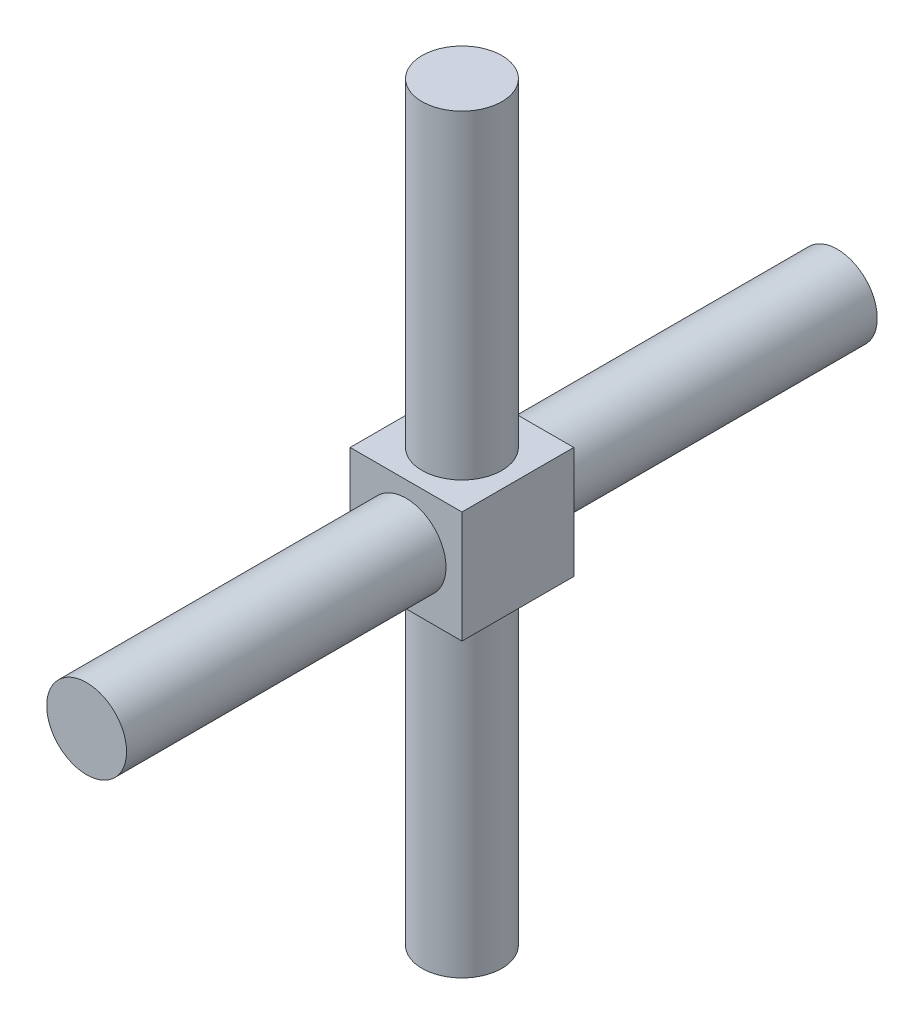
ISO-10303-21;
HEADER;
FILE_DESCRIPTION(('STEP AP214'),'2;1');
FILE_NAME('part.step','',(''),(''),'','','');
FILE_SCHEMA(('AUTOMOTIVE_DESIGN { 1 0 10303 214 1 1 1 1 }'));
ENDSEC;
DATA;
#1=APPLICATION_CONTEXT('core data for automotive mechanical design processes');
#2=APPLICATION_PROTOCOL_DEFINITION('international standard','automotive_design',2000,#1);
#3=PRODUCT_CONTEXT('',#1,'mechanical');
#4=PRODUCT('Part','Part','',(#3));
#5=PRODUCT_RELATED_PRODUCT_CATEGORY('part','',(#4));
#6=PRODUCT_DEFINITION_FORMATION('','',#4);
#7=PRODUCT_DEFINITION_CONTEXT('part definition',#1,'design');
#8=PRODUCT_DEFINITION('design','',#6,#7);
#9=PRODUCT_DEFINITION_SHAPE('','',#8);
#10=(LENGTH_UNIT() NAMED_UNIT(*) SI_UNIT(.MILLI.,.METRE.));
#11=(NAMED_UNIT(*) PLANE_ANGLE_UNIT() SI_UNIT($,.RADIAN.));
#12=(NAMED_UNIT(*) SI_UNIT($,.STERADIAN.) SOLID_ANGLE_UNIT());
#13=UNCERTAINTY_MEASURE_WITH_UNIT(LENGTH_MEASURE(1.E-05),#10,'distance_accuracy_value','');
#14=(GEOMETRIC_REPRESENTATION_CONTEXT(3) GLOBAL_UNCERTAINTY_ASSIGNED_CONTEXT((#13)) GLOBAL_UNIT_ASSIGNED_CONTEXT((#10,
#11,#12)) REPRESENTATION_CONTEXT('',''));
#15=CARTESIAN_POINT('',(0.,0.,0.));
#16=DIRECTION('',(0.,0.,1.));
#17=DIRECTION('',(1.,0.,0.));
#18=AXIS2_PLACEMENT_3D('',#15,#16,#17);
#19=CARTESIAN_POINT('',(-35.,-35.,70.));
#20=DIRECTION('',(1.,0.,0.));
#21=DIRECTION('',(0.,0.,-1.));
#22=AXIS2_PLACEMENT_3D('',#19,#20,#21);
#23=PLANE('',#22);
#24=DIRECTION('',(0.,-1.,0.));
#25=VECTOR('',#24,1.);
#26=CARTESIAN_POINT('',(-35.,-35.,0.));
#27=LINE('',#26,#25);
#28=CARTESIAN_POINT('',(-35.,35.,0.));
#29=VERTEX_POINT('',#28);
#30=CARTESIAN_POINT('',(-35.,-35.,0.));
#31=VERTEX_POINT('',#30);
#32=EDGE_CURVE('E99',#29,#31,#27,.T.);
#33=ORIENTED_EDGE('',*,*,#32,.T.);
#34=DIRECTION('',(0.,0.,-1.));
#35=VECTOR('',#34,1.);
#36=CARTESIAN_POINT('',(-35.,-35.,70.));
#37=LINE('',#36,#35);
#38=CARTESIAN_POINT('',(-35.,-35.,70.));
#39=VERTEX_POINT('',#38);
#40=EDGE_CURVE('E35',#39,#31,#37,.T.);
#41=ORIENTED_EDGE('',*,*,#40,.F.);
#42=DIRECTION('',(0.,-1.,0.));
#43=VECTOR('',#42,1.);
#44=CARTESIAN_POINT('',(-35.,-35.,70.));
#45=LINE('',#44,#43);
#46=CARTESIAN_POINT('',(-35.,35.,70.));
#47=VERTEX_POINT('',#46);
#48=EDGE_CURVE('E86',#47,#39,#45,.T.);
#49=ORIENTED_EDGE('',*,*,#48,.F.);
#50=DIRECTION('',(0.,0.,-1.));
#51=VECTOR('',#50,1.);
#52=CARTESIAN_POINT('',(-35.,35.,70.));
#53=LINE('',#52,#51);
#54=EDGE_CURVE('E95',#47,#29,#53,.T.);
#55=ORIENTED_EDGE('',*,*,#54,.T.);
#56=EDGE_LOOP('',(#33,#41,#49,#55));
#57=FACE_BOUND('',#56,.T.);
#58=ADVANCED_FACE('F32',(#57),#23,.F.);
#59=CARTESIAN_POINT('',(35.,-35.,70.));
#60=DIRECTION('',(0.,1.,0.));
#61=DIRECTION('',(-1.,0.,0.));
#62=AXIS2_PLACEMENT_3D('',#59,#60,#61);
#63=PLANE('',#62);
#64=CARTESIAN_POINT('',(0.,-35.,35.));
#65=DIRECTION('',(0.,1.,0.));
#66=DIRECTION('',(-1.,0.,0.));
#67=AXIS2_PLACEMENT_3D('',#64,#65,#66);
#68=CIRCLE('',#67,25.);
#69=CARTESIAN_POINT('',(-25.,-35.,35.));
#70=VERTEX_POINT('',#69);
#71=EDGE_CURVE('E127',#70,#70,#68,.T.);
#72=ORIENTED_EDGE('',*,*,#71,.T.);
#73=EDGE_LOOP('',(#72));
#74=FACE_BOUND('',#73,.T.);
#75=DIRECTION('',(1.,0.,0.));
#76=VECTOR('',#75,1.);
#77=CARTESIAN_POINT('',(35.,-35.,0.));
#78=LINE('',#77,#76);
#79=CARTESIAN_POINT('',(35.,-35.,0.));
#80=VERTEX_POINT('',#79);
#81=EDGE_CURVE('E91',#31,#80,#78,.T.);
#82=ORIENTED_EDGE('',*,*,#81,.T.);
#83=DIRECTION('',(0.,0.,-1.));
#84=VECTOR('',#83,1.);
#85=CARTESIAN_POINT('',(35.,-35.,70.));
#86=LINE('',#85,#84);
#87=CARTESIAN_POINT('',(35.,-35.,70.));
#88=VERTEX_POINT('',#87);
#89=EDGE_CURVE('E89',#88,#80,#86,.T.);
#90=ORIENTED_EDGE('',*,*,#89,.F.);
#91=DIRECTION('',(1.,0.,0.));
#92=VECTOR('',#91,1.);
#93=CARTESIAN_POINT('',(35.,-35.,70.));
#94=LINE('',#93,#92);
#95=EDGE_CURVE('E81',#39,#88,#94,.T.);
#96=ORIENTED_EDGE('',*,*,#95,.F.);
#97=ORIENTED_EDGE('',*,*,#40,.T.);
#98=EDGE_LOOP('',(#82,#90,#96,#97));
#99=FACE_BOUND('',#98,.T.);
#100=ADVANCED_FACE('F90',(#74,#99),#63,.F.);
#101=CARTESIAN_POINT('',(35.,-35.,70.));
#102=DIRECTION('',(-1.,0.,0.));
#103=DIRECTION('',(0.,0.,1.));
#104=AXIS2_PLACEMENT_3D('',#101,#102,#103);
#105=PLANE('',#104);
#106=DIRECTION('',(0.,1.,0.));
#107=VECTOR('',#106,1.);
#108=CARTESIAN_POINT('',(35.,-35.,0.));
#109=LINE('',#108,#107);
#110=CARTESIAN_POINT('',(35.,35.,0.));
#111=VERTEX_POINT('',#110);
#112=EDGE_CURVE('E67',#80,#111,#109,.T.);
#113=ORIENTED_EDGE('',*,*,#112,.T.);
#114=DIRECTION('',(0.,0.,-1.));
#115=VECTOR('',#114,1.);
#116=CARTESIAN_POINT('',(35.,35.,70.));
#117=LINE('',#116,#115);
#118=CARTESIAN_POINT('',(35.,35.,70.));
#119=VERTEX_POINT('',#118);
#120=EDGE_CURVE('E92',#119,#111,#117,.T.);
#121=ORIENTED_EDGE('',*,*,#120,.F.);
#122=DIRECTION('',(0.,1.,0.));
#123=VECTOR('',#122,1.);
#124=CARTESIAN_POINT('',(35.,-35.,70.));
#125=LINE('',#124,#123);
#126=EDGE_CURVE('E84',#88,#119,#125,.T.);
#127=ORIENTED_EDGE('',*,*,#126,.F.);
#128=ORIENTED_EDGE('',*,*,#89,.T.);
#129=EDGE_LOOP('',(#113,#121,#127,#128));
#130=FACE_BOUND('',#129,.T.);
#131=ADVANCED_FACE('F93',(#130),#105,.F.);
#132=CARTESIAN_POINT('',(35.,35.,70.));
#133=DIRECTION('',(0.,-1.,0.));
#134=DIRECTION('',(1.,0.,0.));
#135=AXIS2_PLACEMENT_3D('',#132,#133,#134);
#136=PLANE('',#135);
#137=CARTESIAN_POINT('',(0.,35.,35.));
#138=DIRECTION('',(0.,1.,0.));
#139=DIRECTION('',(-1.,0.,0.));
#140=AXIS2_PLACEMENT_3D('',#137,#138,#139);
#141=CIRCLE('',#140,25.);
#142=CARTESIAN_POINT('',(-25.,35.,35.));
#143=VERTEX_POINT('',#142);
#144=EDGE_CURVE('E11',#143,#143,#141,.T.);
#145=ORIENTED_EDGE('',*,*,#144,.F.);
#146=EDGE_LOOP('',(#145));
#147=FACE_BOUND('',#146,.T.);
#148=DIRECTION('',(-1.,0.,0.));
#149=VECTOR('',#148,1.);
#150=CARTESIAN_POINT('',(35.,35.,0.));
#151=LINE('',#150,#149);
#152=EDGE_CURVE('E73',#111,#29,#151,.T.);
#153=ORIENTED_EDGE('',*,*,#152,.T.);
#154=ORIENTED_EDGE('',*,*,#54,.F.);
#155=DIRECTION('',(-1.,0.,0.));
#156=VECTOR('',#155,1.);
#157=CARTESIAN_POINT('',(35.,35.,70.));
#158=LINE('',#157,#156);
#159=EDGE_CURVE('E50',#119,#47,#158,.T.);
#160=ORIENTED_EDGE('',*,*,#159,.F.);
#161=ORIENTED_EDGE('',*,*,#120,.T.);
#162=EDGE_LOOP('',(#153,#154,#160,#161));
#163=FACE_BOUND('',#162,.T.);
#164=ADVANCED_FACE('F107',(#147,#163),#136,.F.);
#165=CARTESIAN_POINT('',(0.,0.,70.));
#166=DIRECTION('',(0.,0.,1.));
#167=DIRECTION('',(1.,0.,0.));
#168=AXIS2_PLACEMENT_3D('',#165,#166,#167);
#169=PLANE('',#168);
#170=CARTESIAN_POINT('',(0.,0.,70.));
#171=DIRECTION('',(0.,0.,1.));
#172=DIRECTION('',(1.,0.,0.));
#173=AXIS2_PLACEMENT_3D('',#170,#171,#172);
#174=CIRCLE('',#173,25.);
#175=CARTESIAN_POINT('',(25.,0.,70.));
#176=VERTEX_POINT('',#175);
#177=EDGE_CURVE('E41',#176,#176,#174,.T.);
#178=ORIENTED_EDGE('',*,*,#177,.F.);
#179=EDGE_LOOP('',(#178));
#180=FACE_BOUND('',#179,.T.);
#181=ORIENTED_EDGE('',*,*,#48,.T.);
#182=ORIENTED_EDGE('',*,*,#95,.T.);
#183=ORIENTED_EDGE('',*,*,#126,.T.);
#184=ORIENTED_EDGE('',*,*,#159,.T.);
#185=EDGE_LOOP('',(#181,#182,#183,#184));
#186=FACE_BOUND('',#185,.T.);
#187=ADVANCED_FACE('F82',(#180,#186),#169,.T.);
#188=CARTESIAN_POINT('',(0.,0.,0.));
#189=DIRECTION('',(0.,0.,1.));
#190=DIRECTION('',(1.,0.,0.));
#191=AXIS2_PLACEMENT_3D('',#188,#189,#190);
#192=PLANE('',#191);
#193=CARTESIAN_POINT('',(0.,0.,0.));
#194=DIRECTION('',(0.,0.,1.));
#195=DIRECTION('',(1.,0.,0.));
#196=AXIS2_PLACEMENT_3D('',#193,#194,#195);
#197=CIRCLE('',#196,25.);
#198=CARTESIAN_POINT('',(25.,0.,0.));
#199=VERTEX_POINT('',#198);
#200=EDGE_CURVE('E118',#199,#199,#197,.T.);
#201=ORIENTED_EDGE('',*,*,#200,.T.);
#202=EDGE_LOOP('',(#201));
#203=FACE_BOUND('',#202,.T.);
#204=ORIENTED_EDGE('',*,*,#32,.F.);
#205=ORIENTED_EDGE('',*,*,#152,.F.);
#206=ORIENTED_EDGE('',*,*,#112,.F.);
#207=ORIENTED_EDGE('',*,*,#81,.F.);
#208=EDGE_LOOP('',(#204,#205,#206,#207));
#209=FACE_BOUND('',#208,.T.);
#210=ADVANCED_FACE('F110',(#203,#209),#192,.F.);
#211=CARTESIAN_POINT('',(0.,0.,270.));
#212=DIRECTION('',(0.,0.,-1.));
#213=DIRECTION('',(-1.,0.,0.));
#214=AXIS2_PLACEMENT_3D('',#211,#212,#213);
#215=CYLINDRICAL_SURFACE('',#214,25.);
#216=CARTESIAN_POINT('',(0.,0.,270.));
#217=DIRECTION('',(0.,0.,1.));
#218=DIRECTION('',(1.,0.,0.));
#219=AXIS2_PLACEMENT_3D('',#216,#217,#218);
#220=CIRCLE('',#219,25.);
#221=CARTESIAN_POINT('',(25.,0.,270.));
#222=VERTEX_POINT('',#221);
#223=EDGE_CURVE('E102',#222,#222,#220,.T.);
#224=ORIENTED_EDGE('',*,*,#223,.F.);
#225=EDGE_LOOP('',(#224));
#226=FACE_BOUND('',#225,.T.);
#227=ORIENTED_EDGE('',*,*,#177,.T.);
#228=EDGE_LOOP('',(#227));
#229=FACE_BOUND('',#228,.T.);
#230=ADVANCED_FACE('F159',(#226,#229),#215,.T.);
#231=CARTESIAN_POINT('',(0.,0.,270.));
#232=DIRECTION('',(0.,0.,1.));
#233=DIRECTION('',(1.,0.,0.));
#234=AXIS2_PLACEMENT_3D('',#231,#232,#233);
#235=PLANE('',#234);
#236=ORIENTED_EDGE('',*,*,#223,.T.);
#237=EDGE_LOOP('',(#236));
#238=FACE_BOUND('',#237,.T.);
#239=ADVANCED_FACE('F166',(#238),#235,.T.);
#240=CARTESIAN_POINT('',(0.,0.,-200.));
#241=DIRECTION('',(0.,0.,1.));
#242=DIRECTION('',(1.,0.,0.));
#243=AXIS2_PLACEMENT_3D('',#240,#241,#242);
#244=CYLINDRICAL_SURFACE('',#243,25.);
#245=CARTESIAN_POINT('',(0.,0.,-200.));
#246=DIRECTION('',(0.,0.,1.));
#247=DIRECTION('',(1.,0.,0.));
#248=AXIS2_PLACEMENT_3D('',#245,#246,#247);
#249=CIRCLE('',#248,25.);
#250=CARTESIAN_POINT('',(25.,0.,-200.));
#251=VERTEX_POINT('',#250);
#252=EDGE_CURVE('E117',#251,#251,#249,.T.);
#253=ORIENTED_EDGE('',*,*,#252,.T.);
#254=EDGE_LOOP('',(#253));
#255=FACE_BOUND('',#254,.T.);
#256=ORIENTED_EDGE('',*,*,#200,.F.);
#257=EDGE_LOOP('',(#256));
#258=FACE_BOUND('',#257,.T.);
#259=ADVANCED_FACE('F170',(#255,#258),#244,.T.);
#260=CARTESIAN_POINT('',(0.,0.,-200.));
#261=DIRECTION('',(0.,0.,-1.));
#262=DIRECTION('',(1.,0.,0.));
#263=AXIS2_PLACEMENT_3D('',#260,#261,#262);
#264=PLANE('',#263);
#265=ORIENTED_EDGE('',*,*,#252,.F.);
#266=EDGE_LOOP('',(#265));
#267=FACE_BOUND('',#266,.T.);
#268=ADVANCED_FACE('F174',(#267),#264,.T.);
#269=CARTESIAN_POINT('',(0.,235.,35.));
#270=DIRECTION('',(0.,-1.,0.));
#271=DIRECTION('',(1.,0.,0.));
#272=AXIS2_PLACEMENT_3D('',#269,#270,#271);
#273=CYLINDRICAL_SURFACE('',#272,25.);
#274=CARTESIAN_POINT('',(0.,235.,35.));
#275=DIRECTION('',(0.,1.,0.));
#276=DIRECTION('',(-1.,0.,0.));
#277=AXIS2_PLACEMENT_3D('',#274,#275,#276);
#278=CIRCLE('',#277,25.);
#279=CARTESIAN_POINT('',(-25.,235.,35.));
#280=VERTEX_POINT('',#279);
#281=EDGE_CURVE('E121',#280,#280,#278,.T.);
#282=ORIENTED_EDGE('',*,*,#281,.F.);
#283=EDGE_LOOP('',(#282));
#284=FACE_BOUND('',#283,.T.);
#285=ORIENTED_EDGE('',*,*,#144,.T.);
#286=EDGE_LOOP('',(#285));
#287=FACE_BOUND('',#286,.T.);
#288=ADVANCED_FACE('F178',(#284,#287),#273,.T.);
#289=CARTESIAN_POINT('',(0.,235.,35.));
#290=DIRECTION('',(0.,1.,0.));
#291=DIRECTION('',(-1.,0.,0.));
#292=AXIS2_PLACEMENT_3D('',#289,#290,#291);
#293=PLANE('',#292);
#294=ORIENTED_EDGE('',*,*,#281,.T.);
#295=EDGE_LOOP('',(#294));
#296=FACE_BOUND('',#295,.T.);
#297=ADVANCED_FACE('F142',(#296),#293,.T.);
#298=CARTESIAN_POINT('',(0.,-235.,35.));
#299=DIRECTION('',(0.,1.,0.));
#300=DIRECTION('',(-1.,0.,0.));
#301=AXIS2_PLACEMENT_3D('',#298,#299,#300);
#302=CYLINDRICAL_SURFACE('',#301,25.);
#303=CARTESIAN_POINT('',(0.,-235.,35.));
#304=DIRECTION('',(0.,1.,0.));
#305=DIRECTION('',(-1.,0.,0.));
#306=AXIS2_PLACEMENT_3D('',#303,#304,#305);
#307=CIRCLE('',#306,25.);
#308=CARTESIAN_POINT('',(-25.,-235.,35.));
#309=VERTEX_POINT('',#308);
#310=EDGE_CURVE('E126',#309,#309,#307,.T.);
#311=ORIENTED_EDGE('',*,*,#310,.T.);
#312=EDGE_LOOP('',(#311));
#313=FACE_BOUND('',#312,.T.);
#314=ORIENTED_EDGE('',*,*,#71,.F.);
#315=EDGE_LOOP('',(#314));
#316=FACE_BOUND('',#315,.T.);
#317=ADVANCED_FACE('F133',(#313,#316),#302,.T.);
#318=CARTESIAN_POINT('',(0.,-235.,35.));
#319=DIRECTION('',(0.,-1.,0.));
#320=DIRECTION('',(-1.,0.,0.));
#321=AXIS2_PLACEMENT_3D('',#318,#319,#320);
#322=PLANE('',#321);
#323=ORIENTED_EDGE('',*,*,#310,.F.);
#324=EDGE_LOOP('',(#323));
#325=FACE_BOUND('',#324,.T.);
#326=ADVANCED_FACE('F136',(#325),#322,.T.);
#327=CLOSED_SHELL('',(#58,#100,#131,#164,#187,#210,#230,#239,#259,#268,#288,#297,#317,#326));
#328=MANIFOLD_SOLID_BREP('B2',#327);
#329=ADVANCED_BREP_SHAPE_REPRESENTATION('',(#18,#328),#14);
#330=SHAPE_DEFINITION_REPRESENTATION(#9,#329);
ENDSEC;
END-ISO-10303-21;
